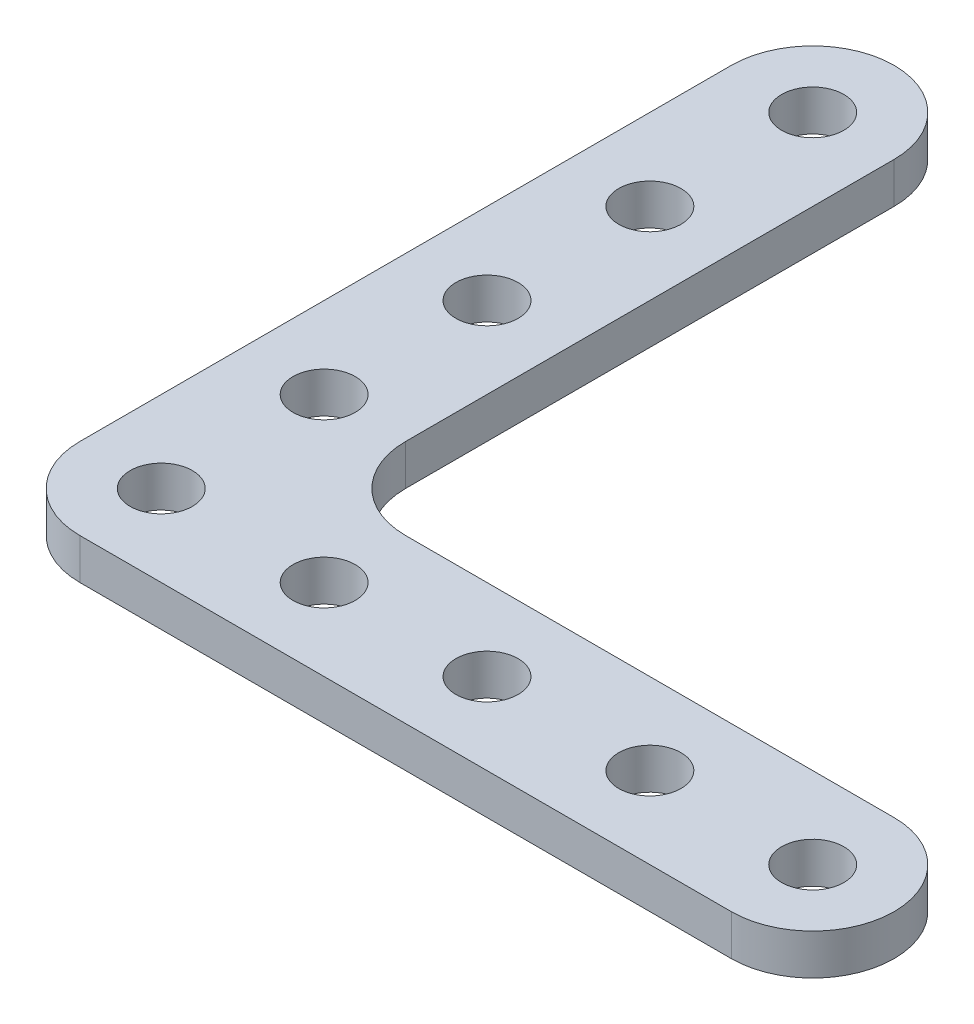
ISO-10303-21;
HEADER;
FILE_DESCRIPTION(('STEP AP214'),'2;1');
FILE_NAME('part.step','',(''),(''),'','','');
FILE_SCHEMA(('AUTOMOTIVE_DESIGN { 1 0 10303 214 1 1 1 1 }'));
ENDSEC;
DATA;
#1=APPLICATION_CONTEXT('core data for automotive mechanical design processes');
#2=APPLICATION_PROTOCOL_DEFINITION('international standard','automotive_design',2000,#1);
#3=PRODUCT_CONTEXT('',#1,'mechanical');
#4=PRODUCT('Part','Part','',(#3));
#5=PRODUCT_RELATED_PRODUCT_CATEGORY('part','',(#4));
#6=PRODUCT_DEFINITION_FORMATION('','',#4);
#7=PRODUCT_DEFINITION_CONTEXT('part definition',#1,'design');
#8=PRODUCT_DEFINITION('design','',#6,#7);
#9=PRODUCT_DEFINITION_SHAPE('','',#8);
#10=(LENGTH_UNIT() NAMED_UNIT(*) SI_UNIT(.MILLI.,.METRE.));
#11=(NAMED_UNIT(*) PLANE_ANGLE_UNIT() SI_UNIT($,.RADIAN.));
#12=(NAMED_UNIT(*) SI_UNIT($,.STERADIAN.) SOLID_ANGLE_UNIT());
#13=UNCERTAINTY_MEASURE_WITH_UNIT(LENGTH_MEASURE(1.E-05),#10,'distance_accuracy_value','');
#14=(GEOMETRIC_REPRESENTATION_CONTEXT(3) GLOBAL_UNCERTAINTY_ASSIGNED_CONTEXT((#13)) GLOBAL_UNIT_ASSIGNED_CONTEXT((#10,
#11,#12)) REPRESENTATION_CONTEXT('',''));
#15=CARTESIAN_POINT('',(0.,0.,0.));
#16=DIRECTION('',(0.,0.,1.));
#17=DIRECTION('',(1.,0.,0.));
#18=AXIS2_PLACEMENT_3D('',#15,#16,#17);
#19=CARTESIAN_POINT('',(-165.1,-28.575,349.25));
#20=DIRECTION('',(0.,0.,1.));
#21=DIRECTION('',(1.,0.,0.));
#22=AXIS2_PLACEMENT_3D('',#19,#20,#21);
#23=PLANE('',#22);
#24=DIRECTION('',(1.,0.,0.));
#25=VECTOR('',#24,1.);
#26=CARTESIAN_POINT('',(-165.1,-25.4,349.25));
#27=LINE('',#26,#25);
#28=CARTESIAN_POINT('',(-190.5,-25.4,349.25));
#29=VERTEX_POINT('',#28);
#30=CARTESIAN_POINT('',(-139.7,-25.4,349.25));
#31=VERTEX_POINT('',#30);
#32=EDGE_CURVE('E131',#29,#31,#27,.T.);
#33=ORIENTED_EDGE('',*,*,#32,.F.);
#34=DIRECTION('',(0.,1.,0.));
#35=VECTOR('',#34,1.);
#36=CARTESIAN_POINT('',(-190.5,-28.575,349.25));
#37=LINE('',#36,#35);
#38=CARTESIAN_POINT('',(-190.5,-28.575,349.25));
#39=VERTEX_POINT('',#38);
#40=EDGE_CURVE('E11',#39,#29,#37,.T.);
#41=ORIENTED_EDGE('',*,*,#40,.F.);
#42=DIRECTION('',(1.,0.,0.));
#43=VECTOR('',#42,1.);
#44=CARTESIAN_POINT('',(-165.1,-28.575,349.25));
#45=LINE('',#44,#43);
#46=CARTESIAN_POINT('',(-139.7,-28.575,349.25));
#47=VERTEX_POINT('',#46);
#48=EDGE_CURVE('E179',#39,#47,#45,.T.);
#49=ORIENTED_EDGE('',*,*,#48,.T.);
#50=DIRECTION('',(0.,1.,0.));
#51=VECTOR('',#50,1.);
#52=CARTESIAN_POINT('',(-139.7,-28.575,349.25));
#53=LINE('',#52,#51);
#54=EDGE_CURVE('E130',#47,#31,#53,.T.);
#55=ORIENTED_EDGE('',*,*,#54,.T.);
#56=EDGE_LOOP('',(#33,#41,#49,#55));
#57=FACE_BOUND('',#56,.T.);
#58=ADVANCED_FACE('F17',(#57),#23,.T.);
#59=CARTESIAN_POINT('',(-190.5,-28.575,342.9));
#60=DIRECTION('',(0.,1.,0.));
#61=DIRECTION('',(0.,0.,1.));
#62=AXIS2_PLACEMENT_3D('',#59,#60,#61);
#63=CYLINDRICAL_SURFACE('',#62,6.35);
#64=CARTESIAN_POINT('',(-190.5,-25.4,342.9));
#65=DIRECTION('',(0.,-1.,0.));
#66=DIRECTION('',(0.,0.,-1.));
#67=AXIS2_PLACEMENT_3D('',#64,#65,#66);
#68=CIRCLE('',#67,6.35);
#69=CARTESIAN_POINT('',(-196.85,-25.4,342.9));
#70=VERTEX_POINT('',#69);
#71=EDGE_CURVE('E152',#29,#70,#68,.T.);
#72=ORIENTED_EDGE('',*,*,#71,.T.);
#73=DIRECTION('',(0.,1.,0.));
#74=VECTOR('',#73,1.);
#75=CARTESIAN_POINT('',(-196.85,-28.575,342.9));
#76=LINE('',#75,#74);
#77=CARTESIAN_POINT('',(-196.85,-28.575,342.9));
#78=VERTEX_POINT('',#77);
#79=EDGE_CURVE('E26',#78,#70,#76,.T.);
#80=ORIENTED_EDGE('',*,*,#79,.F.);
#81=CARTESIAN_POINT('',(-190.5,-28.575,342.9));
#82=DIRECTION('',(0.,-1.,0.));
#83=DIRECTION('',(0.,0.,-1.));
#84=AXIS2_PLACEMENT_3D('',#81,#82,#83);
#85=CIRCLE('',#84,6.35);
#86=EDGE_CURVE('E105',#39,#78,#85,.T.);
#87=ORIENTED_EDGE('',*,*,#86,.F.);
#88=ORIENTED_EDGE('',*,*,#40,.T.);
#89=EDGE_LOOP('',(#72,#80,#87,#88));
#90=FACE_BOUND('',#89,.T.);
#91=ADVANCED_FACE('F210',(#90),#63,.T.);
#92=CARTESIAN_POINT('',(-196.85,-28.575,317.5));
#93=DIRECTION('',(-1.,0.,0.));
#94=DIRECTION('',(0.,0.,1.));
#95=AXIS2_PLACEMENT_3D('',#92,#93,#94);
#96=PLANE('',#95);
#97=DIRECTION('',(0.,0.,1.));
#98=VECTOR('',#97,1.);
#99=CARTESIAN_POINT('',(-196.85,-25.4,317.5));
#100=LINE('',#99,#98);
#101=CARTESIAN_POINT('',(-196.85,-25.4,292.1));
#102=VERTEX_POINT('',#101);
#103=EDGE_CURVE('E92',#102,#70,#100,.T.);
#104=ORIENTED_EDGE('',*,*,#103,.F.);
#105=DIRECTION('',(0.,1.,0.));
#106=VECTOR('',#105,1.);
#107=CARTESIAN_POINT('',(-196.85,-28.575,292.1));
#108=LINE('',#107,#106);
#109=CARTESIAN_POINT('',(-196.85,-28.575,292.1));
#110=VERTEX_POINT('',#109);
#111=EDGE_CURVE('E86',#110,#102,#108,.T.);
#112=ORIENTED_EDGE('',*,*,#111,.F.);
#113=DIRECTION('',(0.,0.,1.));
#114=VECTOR('',#113,1.);
#115=CARTESIAN_POINT('',(-196.85,-28.575,317.5));
#116=LINE('',#115,#114);
#117=EDGE_CURVE('E90',#110,#78,#116,.T.);
#118=ORIENTED_EDGE('',*,*,#117,.T.);
#119=ORIENTED_EDGE('',*,*,#79,.T.);
#120=EDGE_LOOP('',(#104,#112,#118,#119));
#121=FACE_BOUND('',#120,.T.);
#122=ADVANCED_FACE('F88',(#121),#96,.T.);
#123=CARTESIAN_POINT('',(-190.5,-28.575,292.1));
#124=DIRECTION('',(0.,1.,0.));
#125=DIRECTION('',(0.,0.,1.));
#126=AXIS2_PLACEMENT_3D('',#123,#124,#125);
#127=CYLINDRICAL_SURFACE('',#126,6.35);
#128=CARTESIAN_POINT('',(-190.5,-25.4,292.1));
#129=DIRECTION('',(0.,-1.,0.));
#130=DIRECTION('',(0.,0.,-1.));
#131=AXIS2_PLACEMENT_3D('',#128,#129,#130);
#132=CIRCLE('',#131,6.35);
#133=CARTESIAN_POINT('',(-184.15,-25.4,292.1));
#134=VERTEX_POINT('',#133);
#135=EDGE_CURVE('E156',#102,#134,#132,.T.);
#136=ORIENTED_EDGE('',*,*,#135,.T.);
#137=DIRECTION('',(0.,1.,0.));
#138=VECTOR('',#137,1.);
#139=CARTESIAN_POINT('',(-184.15,-28.575,292.1));
#140=LINE('',#139,#138);
#141=CARTESIAN_POINT('',(-184.15,-28.575,292.1));
#142=VERTEX_POINT('',#141);
#143=EDGE_CURVE('E61',#142,#134,#140,.T.);
#144=ORIENTED_EDGE('',*,*,#143,.F.);
#145=CARTESIAN_POINT('',(-190.5,-28.575,292.1));
#146=DIRECTION('',(0.,-1.,0.));
#147=DIRECTION('',(0.,0.,-1.));
#148=AXIS2_PLACEMENT_3D('',#145,#146,#147);
#149=CIRCLE('',#148,6.35);
#150=EDGE_CURVE('E96',#110,#142,#149,.T.);
#151=ORIENTED_EDGE('',*,*,#150,.F.);
#152=ORIENTED_EDGE('',*,*,#111,.T.);
#153=EDGE_LOOP('',(#136,#144,#151,#152));
#154=FACE_BOUND('',#153,.T.);
#155=ADVANCED_FACE('F97',(#154),#127,.T.);
#156=CARTESIAN_POINT('',(-184.15,-28.575,311.15));
#157=DIRECTION('',(1.,0.,0.));
#158=DIRECTION('',(0.,0.,-1.));
#159=AXIS2_PLACEMENT_3D('',#156,#157,#158);
#160=PLANE('',#159);
#161=DIRECTION('',(0.,0.,-1.));
#162=VECTOR('',#161,1.);
#163=CARTESIAN_POINT('',(-184.15,-25.4,311.15));
#164=LINE('',#163,#162);
#165=CARTESIAN_POINT('',(-184.15,-25.4,330.2));
#166=VERTEX_POINT('',#165);
#167=EDGE_CURVE('E158',#166,#134,#164,.T.);
#168=ORIENTED_EDGE('',*,*,#167,.F.);
#169=DIRECTION('',(0.,1.,0.));
#170=VECTOR('',#169,1.);
#171=CARTESIAN_POINT('',(-184.15,-28.575,330.2));
#172=LINE('',#171,#170);
#173=CARTESIAN_POINT('',(-184.15,-28.575,330.2));
#174=VERTEX_POINT('',#173);
#175=EDGE_CURVE('E35',#174,#166,#172,.T.);
#176=ORIENTED_EDGE('',*,*,#175,.F.);
#177=DIRECTION('',(0.,0.,-1.));
#178=VECTOR('',#177,1.);
#179=CARTESIAN_POINT('',(-184.15,-28.575,311.15));
#180=LINE('',#179,#178);
#181=EDGE_CURVE('E99',#174,#142,#180,.T.);
#182=ORIENTED_EDGE('',*,*,#181,.T.);
#183=ORIENTED_EDGE('',*,*,#143,.T.);
#184=EDGE_LOOP('',(#168,#176,#182,#183));
#185=FACE_BOUND('',#184,.T.);
#186=ADVANCED_FACE('F198',(#185),#160,.T.);
#187=CARTESIAN_POINT('',(-177.8,-28.575,330.2));
#188=DIRECTION('',(0.,1.,0.));
#189=DIRECTION('',(0.,0.,1.));
#190=AXIS2_PLACEMENT_3D('',#187,#188,#189);
#191=CYLINDRICAL_SURFACE('',#190,6.35);
#192=CARTESIAN_POINT('',(-177.8,-25.4,330.2));
#193=DIRECTION('',(0.,-1.,0.));
#194=DIRECTION('',(0.,0.,-1.));
#195=AXIS2_PLACEMENT_3D('',#192,#193,#194);
#196=CIRCLE('',#195,6.35);
#197=CARTESIAN_POINT('',(-177.8,-25.4,336.55));
#198=VERTEX_POINT('',#197);
#199=EDGE_CURVE('E161',#198,#166,#196,.T.);
#200=ORIENTED_EDGE('',*,*,#199,.F.);
#201=DIRECTION('',(0.,1.,0.));
#202=VECTOR('',#201,1.);
#203=CARTESIAN_POINT('',(-177.8,-28.575,336.55));
#204=LINE('',#203,#202);
#205=CARTESIAN_POINT('',(-177.8,-28.575,336.55));
#206=VERTEX_POINT('',#205);
#207=EDGE_CURVE('E20',#206,#198,#204,.T.);
#208=ORIENTED_EDGE('',*,*,#207,.F.);
#209=CARTESIAN_POINT('',(-177.8,-28.575,330.2));
#210=DIRECTION('',(0.,-1.,0.));
#211=DIRECTION('',(0.,0.,-1.));
#212=AXIS2_PLACEMENT_3D('',#209,#210,#211);
#213=CIRCLE('',#212,6.35);
#214=EDGE_CURVE('E113',#206,#174,#213,.T.);
#215=ORIENTED_EDGE('',*,*,#214,.T.);
#216=ORIENTED_EDGE('',*,*,#175,.T.);
#217=EDGE_LOOP('',(#200,#208,#215,#216));
#218=FACE_BOUND('',#217,.T.);
#219=ADVANCED_FACE('F196',(#218),#191,.F.);
#220=CARTESIAN_POINT('',(-158.75,-28.575,336.55));
#221=DIRECTION('',(0.,0.,-1.));
#222=DIRECTION('',(-1.,0.,0.));
#223=AXIS2_PLACEMENT_3D('',#220,#221,#222);
#224=PLANE('',#223);
#225=DIRECTION('',(-1.,0.,0.));
#226=VECTOR('',#225,1.);
#227=CARTESIAN_POINT('',(-158.75,-25.4,336.55));
#228=LINE('',#227,#226);
#229=CARTESIAN_POINT('',(-139.7,-25.4,336.55));
#230=VERTEX_POINT('',#229);
#231=EDGE_CURVE('E137',#230,#198,#228,.T.);
#232=ORIENTED_EDGE('',*,*,#231,.F.);
#233=DIRECTION('',(0.,1.,0.));
#234=VECTOR('',#233,1.);
#235=CARTESIAN_POINT('',(-139.7,-28.575,336.55));
#236=LINE('',#235,#234);
#237=CARTESIAN_POINT('',(-139.7,-28.575,336.55));
#238=VERTEX_POINT('',#237);
#239=EDGE_CURVE('E183',#238,#230,#236,.T.);
#240=ORIENTED_EDGE('',*,*,#239,.F.);
#241=DIRECTION('',(-1.,0.,0.));
#242=VECTOR('',#241,1.);
#243=CARTESIAN_POINT('',(-158.75,-28.575,336.55));
#244=LINE('',#243,#242);
#245=EDGE_CURVE('E191',#238,#206,#244,.T.);
#246=ORIENTED_EDGE('',*,*,#245,.T.);
#247=ORIENTED_EDGE('',*,*,#207,.T.);
#248=EDGE_LOOP('',(#232,#240,#246,#247));
#249=FACE_BOUND('',#248,.T.);
#250=ADVANCED_FACE('F189',(#249),#224,.T.);
#251=CARTESIAN_POINT('',(-190.5,-28.575,304.8));
#252=DIRECTION('',(0.,1.,0.));
#253=DIRECTION('',(0.,0.,1.));
#254=AXIS2_PLACEMENT_3D('',#251,#252,#253);
#255=CYLINDRICAL_SURFACE('',#254,2.4257);
#256=CARTESIAN_POINT('',(-190.5,-28.575,304.8));
#257=DIRECTION('',(0.,-1.,0.));
#258=DIRECTION('',(0.,0.,-1.));
#259=AXIS2_PLACEMENT_3D('',#256,#257,#258);
#260=CIRCLE('',#259,2.4257);
#261=CARTESIAN_POINT('',(-190.5,-28.575,302.3743));
#262=VERTEX_POINT('',#261);
#263=EDGE_CURVE('E124',#262,#262,#260,.T.);
#264=ORIENTED_EDGE('',*,*,#263,.T.);
#265=EDGE_LOOP('',(#264));
#266=FACE_BOUND('',#265,.T.);
#267=CARTESIAN_POINT('',(-190.5,-25.4,304.8));
#268=DIRECTION('',(0.,-1.,0.));
#269=DIRECTION('',(0.,0.,-1.));
#270=AXIS2_PLACEMENT_3D('',#267,#268,#269);
#271=CIRCLE('',#270,2.4257);
#272=CARTESIAN_POINT('',(-190.5,-25.4,302.3743));
#273=VERTEX_POINT('',#272);
#274=EDGE_CURVE('E173',#273,#273,#271,.T.);
#275=ORIENTED_EDGE('',*,*,#274,.F.);
#276=EDGE_LOOP('',(#275));
#277=FACE_BOUND('',#276,.T.);
#278=ADVANCED_FACE('F205',(#266,#277),#255,.F.);
#279=CARTESIAN_POINT('',(-190.5,-28.575,317.5));
#280=DIRECTION('',(0.,1.,0.));
#281=DIRECTION('',(0.,0.,1.));
#282=AXIS2_PLACEMENT_3D('',#279,#280,#281);
#283=CYLINDRICAL_SURFACE('',#282,2.4257);
#284=CARTESIAN_POINT('',(-190.5,-28.575,317.5));
#285=DIRECTION('',(0.,-1.,0.));
#286=DIRECTION('',(0.,0.,-1.));
#287=AXIS2_PLACEMENT_3D('',#284,#285,#286);
#288=CIRCLE('',#287,2.4257);
#289=CARTESIAN_POINT('',(-190.5,-28.575,315.0743));
#290=VERTEX_POINT('',#289);
#291=EDGE_CURVE('E121',#290,#290,#288,.T.);
#292=ORIENTED_EDGE('',*,*,#291,.T.);
#293=EDGE_LOOP('',(#292));
#294=FACE_BOUND('',#293,.T.);
#295=CARTESIAN_POINT('',(-190.5,-25.4,317.5));
#296=DIRECTION('',(0.,-1.,0.));
#297=DIRECTION('',(0.,0.,-1.));
#298=AXIS2_PLACEMENT_3D('',#295,#296,#297);
#299=CIRCLE('',#298,2.4257);
#300=CARTESIAN_POINT('',(-190.5,-25.4,315.0743));
#301=VERTEX_POINT('',#300);
#302=EDGE_CURVE('E170',#301,#301,#299,.T.);
#303=ORIENTED_EDGE('',*,*,#302,.F.);
#304=EDGE_LOOP('',(#303));
#305=FACE_BOUND('',#304,.T.);
#306=ADVANCED_FACE('F267',(#294,#305),#283,.F.);
#307=CARTESIAN_POINT('',(-190.5,-28.575,330.2));
#308=DIRECTION('',(0.,1.,0.));
#309=DIRECTION('',(0.,0.,1.));
#310=AXIS2_PLACEMENT_3D('',#307,#308,#309);
#311=CYLINDRICAL_SURFACE('',#310,2.4257);
#312=CARTESIAN_POINT('',(-190.5,-28.575,330.2));
#313=DIRECTION('',(0.,-1.,0.));
#314=DIRECTION('',(0.,0.,-1.));
#315=AXIS2_PLACEMENT_3D('',#312,#313,#314);
#316=CIRCLE('',#315,2.4257);
#317=CARTESIAN_POINT('',(-190.5,-28.575,327.7743));
#318=VERTEX_POINT('',#317);
#319=EDGE_CURVE('E118',#318,#318,#316,.T.);
#320=ORIENTED_EDGE('',*,*,#319,.T.);
#321=EDGE_LOOP('',(#320));
#322=FACE_BOUND('',#321,.T.);
#323=CARTESIAN_POINT('',(-190.5,-25.4,330.2));
#324=DIRECTION('',(0.,-1.,0.));
#325=DIRECTION('',(0.,0.,-1.));
#326=AXIS2_PLACEMENT_3D('',#323,#324,#325);
#327=CIRCLE('',#326,2.4257);
#328=CARTESIAN_POINT('',(-190.5,-25.4,327.7743));
#329=VERTEX_POINT('',#328);
#330=EDGE_CURVE('E167',#329,#329,#327,.T.);
#331=ORIENTED_EDGE('',*,*,#330,.F.);
#332=EDGE_LOOP('',(#331));
#333=FACE_BOUND('',#332,.T.);
#334=ADVANCED_FACE('F271',(#322,#333),#311,.F.);
#335=CARTESIAN_POINT('',(-190.5,-28.575,342.9));
#336=DIRECTION('',(0.,1.,0.));
#337=DIRECTION('',(0.,0.,1.));
#338=AXIS2_PLACEMENT_3D('',#335,#336,#337);
#339=CYLINDRICAL_SURFACE('',#338,2.4257);
#340=CARTESIAN_POINT('',(-190.5,-28.575,342.9));
#341=DIRECTION('',(0.,-1.,0.));
#342=DIRECTION('',(0.,0.,-1.));
#343=AXIS2_PLACEMENT_3D('',#340,#341,#342);
#344=CIRCLE('',#343,2.4257);
#345=CARTESIAN_POINT('',(-190.5,-28.575,340.4743));
#346=VERTEX_POINT('',#345);
#347=EDGE_CURVE('E115',#346,#346,#344,.T.);
#348=ORIENTED_EDGE('',*,*,#347,.T.);
#349=EDGE_LOOP('',(#348));
#350=FACE_BOUND('',#349,.T.);
#351=CARTESIAN_POINT('',(-190.5,-25.4,342.9));
#352=DIRECTION('',(0.,-1.,0.));
#353=DIRECTION('',(0.,0.,-1.));
#354=AXIS2_PLACEMENT_3D('',#351,#352,#353);
#355=CIRCLE('',#354,2.4257);
#356=CARTESIAN_POINT('',(-190.5,-25.4,340.4743));
#357=VERTEX_POINT('',#356);
#358=EDGE_CURVE('E164',#357,#357,#355,.T.);
#359=ORIENTED_EDGE('',*,*,#358,.F.);
#360=EDGE_LOOP('',(#359));
#361=FACE_BOUND('',#360,.T.);
#362=ADVANCED_FACE('F274',(#350,#361),#339,.F.);
#363=CARTESIAN_POINT('',(-139.7,-28.575,342.9));
#364=DIRECTION('',(0.,1.,0.));
#365=DIRECTION('',(0.,0.,1.));
#366=AXIS2_PLACEMENT_3D('',#363,#364,#365);
#367=CYLINDRICAL_SURFACE('',#366,2.4257);
#368=CARTESIAN_POINT('',(-139.7,-28.575,342.9));
#369=DIRECTION('',(0.,-1.,0.));
#370=DIRECTION('',(0.,0.,-1.));
#371=AXIS2_PLACEMENT_3D('',#368,#369,#370);
#372=CIRCLE('',#371,2.4257);
#373=CARTESIAN_POINT('',(-139.7,-28.575,340.4743));
#374=VERTEX_POINT('',#373);
#375=EDGE_CURVE('E108',#374,#374,#372,.T.);
#376=ORIENTED_EDGE('',*,*,#375,.T.);
#377=EDGE_LOOP('',(#376));
#378=FACE_BOUND('',#377,.T.);
#379=CARTESIAN_POINT('',(-139.7,-25.4,342.9));
#380=DIRECTION('',(0.,-1.,0.));
#381=DIRECTION('',(0.,0.,-1.));
#382=AXIS2_PLACEMENT_3D('',#379,#380,#381);
#383=CIRCLE('',#382,2.4257);
#384=CARTESIAN_POINT('',(-139.7,-25.4,340.4743));
#385=VERTEX_POINT('',#384);
#386=EDGE_CURVE('E149',#385,#385,#383,.T.);
#387=ORIENTED_EDGE('',*,*,#386,.F.);
#388=EDGE_LOOP('',(#387));
#389=FACE_BOUND('',#388,.T.);
#390=ADVANCED_FACE('F237',(#378,#389),#367,.F.);
#391=CARTESIAN_POINT('',(-152.4,-28.575,342.9));
#392=DIRECTION('',(0.,1.,0.));
#393=DIRECTION('',(0.,0.,1.));
#394=AXIS2_PLACEMENT_3D('',#391,#392,#393);
#395=CYLINDRICAL_SURFACE('',#394,2.4257);
#396=CARTESIAN_POINT('',(-152.4,-28.575,342.9));
#397=DIRECTION('',(0.,-1.,0.));
#398=DIRECTION('',(0.,0.,-1.));
#399=AXIS2_PLACEMENT_3D('',#396,#397,#398);
#400=CIRCLE('',#399,2.4257);
#401=CARTESIAN_POINT('',(-152.4,-28.575,340.4743));
#402=VERTEX_POINT('',#401);
#403=EDGE_CURVE('E232',#402,#402,#400,.T.);
#404=ORIENTED_EDGE('',*,*,#403,.T.);
#405=EDGE_LOOP('',(#404));
#406=FACE_BOUND('',#405,.T.);
#407=CARTESIAN_POINT('',(-152.4,-25.4,342.9));
#408=DIRECTION('',(0.,-1.,0.));
#409=DIRECTION('',(0.,0.,-1.));
#410=AXIS2_PLACEMENT_3D('',#407,#408,#409);
#411=CIRCLE('',#410,2.4257);
#412=CARTESIAN_POINT('',(-152.4,-25.4,340.4743));
#413=VERTEX_POINT('',#412);
#414=EDGE_CURVE('E146',#413,#413,#411,.T.);
#415=ORIENTED_EDGE('',*,*,#414,.F.);
#416=EDGE_LOOP('',(#415));
#417=FACE_BOUND('',#416,.T.);
#418=ADVANCED_FACE('F281',(#406,#417),#395,.F.);
#419=CARTESIAN_POINT('',(-165.1,-28.575,342.9));
#420=DIRECTION('',(0.,1.,0.));
#421=DIRECTION('',(0.,0.,1.));
#422=AXIS2_PLACEMENT_3D('',#419,#420,#421);
#423=CYLINDRICAL_SURFACE('',#422,2.4257);
#424=CARTESIAN_POINT('',(-165.1,-28.575,342.9));
#425=DIRECTION('',(0.,-1.,0.));
#426=DIRECTION('',(0.,0.,-1.));
#427=AXIS2_PLACEMENT_3D('',#424,#425,#426);
#428=CIRCLE('',#427,2.4257);
#429=CARTESIAN_POINT('',(-165.1,-28.575,340.4743));
#430=VERTEX_POINT('',#429);
#431=EDGE_CURVE('E229',#430,#430,#428,.T.);
#432=ORIENTED_EDGE('',*,*,#431,.T.);
#433=EDGE_LOOP('',(#432));
#434=FACE_BOUND('',#433,.T.);
#435=CARTESIAN_POINT('',(-165.1,-25.4,342.9));
#436=DIRECTION('',(0.,-1.,0.));
#437=DIRECTION('',(0.,0.,-1.));
#438=AXIS2_PLACEMENT_3D('',#435,#436,#437);
#439=CIRCLE('',#438,2.4257);
#440=CARTESIAN_POINT('',(-165.1,-25.4,340.4743));
#441=VERTEX_POINT('',#440);
#442=EDGE_CURVE('E143',#441,#441,#439,.T.);
#443=ORIENTED_EDGE('',*,*,#442,.F.);
#444=EDGE_LOOP('',(#443));
#445=FACE_BOUND('',#444,.T.);
#446=ADVANCED_FACE('F298',(#434,#445),#423,.F.);
#447=CARTESIAN_POINT('',(-177.8,-28.575,342.9));
#448=DIRECTION('',(0.,1.,0.));
#449=DIRECTION('',(0.,0.,1.));
#450=AXIS2_PLACEMENT_3D('',#447,#448,#449);
#451=CYLINDRICAL_SURFACE('',#450,2.4257);
#452=CARTESIAN_POINT('',(-177.8,-28.575,342.9));
#453=DIRECTION('',(0.,-1.,0.));
#454=DIRECTION('',(0.,0.,-1.));
#455=AXIS2_PLACEMENT_3D('',#452,#453,#454);
#456=CIRCLE('',#455,2.4257);
#457=CARTESIAN_POINT('',(-177.8,-28.575,340.4743));
#458=VERTEX_POINT('',#457);
#459=EDGE_CURVE('E222',#458,#458,#456,.T.);
#460=ORIENTED_EDGE('',*,*,#459,.T.);
#461=EDGE_LOOP('',(#460));
#462=FACE_BOUND('',#461,.T.);
#463=CARTESIAN_POINT('',(-177.8,-25.4,342.9));
#464=DIRECTION('',(0.,-1.,0.));
#465=DIRECTION('',(0.,0.,-1.));
#466=AXIS2_PLACEMENT_3D('',#463,#464,#465);
#467=CIRCLE('',#466,2.4257);
#468=CARTESIAN_POINT('',(-177.8,-25.4,340.4743));
#469=VERTEX_POINT('',#468);
#470=EDGE_CURVE('E134',#469,#469,#467,.T.);
#471=ORIENTED_EDGE('',*,*,#470,.F.);
#472=EDGE_LOOP('',(#471));
#473=FACE_BOUND('',#472,.T.);
#474=ADVANCED_FACE('F305',(#462,#473),#451,.F.);
#475=CARTESIAN_POINT('',(-139.7,-28.575,342.9));
#476=DIRECTION('',(0.,1.,0.));
#477=DIRECTION('',(0.,0.,1.));
#478=AXIS2_PLACEMENT_3D('',#475,#476,#477);
#479=CYLINDRICAL_SURFACE('',#478,6.35);
#480=CARTESIAN_POINT('',(-139.7,-25.4,342.9));
#481=DIRECTION('',(0.,-1.,0.));
#482=DIRECTION('',(0.,0.,-1.));
#483=AXIS2_PLACEMENT_3D('',#480,#481,#482);
#484=CIRCLE('',#483,6.35);
#485=EDGE_CURVE('E140',#230,#31,#484,.T.);
#486=ORIENTED_EDGE('',*,*,#485,.T.);
#487=ORIENTED_EDGE('',*,*,#54,.F.);
#488=CARTESIAN_POINT('',(-139.7,-28.575,342.9));
#489=DIRECTION('',(0.,-1.,0.));
#490=DIRECTION('',(0.,0.,-1.));
#491=AXIS2_PLACEMENT_3D('',#488,#489,#490);
#492=CIRCLE('',#491,6.35);
#493=EDGE_CURVE('E221',#238,#47,#492,.T.);
#494=ORIENTED_EDGE('',*,*,#493,.F.);
#495=ORIENTED_EDGE('',*,*,#239,.T.);
#496=EDGE_LOOP('',(#486,#487,#494,#495));
#497=FACE_BOUND('',#496,.T.);
#498=ADVANCED_FACE('F256',(#497),#479,.T.);
#499=CARTESIAN_POINT('',(-190.5,-28.575,292.1));
#500=DIRECTION('',(0.,1.,0.));
#501=DIRECTION('',(0.,0.,1.));
#502=AXIS2_PLACEMENT_3D('',#499,#500,#501);
#503=CYLINDRICAL_SURFACE('',#502,2.4257);
#504=CARTESIAN_POINT('',(-190.5,-28.575,292.1));
#505=DIRECTION('',(0.,-1.,0.));
#506=DIRECTION('',(0.,0.,-1.));
#507=AXIS2_PLACEMENT_3D('',#504,#505,#506);
#508=CIRCLE('',#507,2.4257);
#509=CARTESIAN_POINT('',(-190.5,-28.575,289.6743));
#510=VERTEX_POINT('',#509);
#511=EDGE_CURVE('E127',#510,#510,#508,.T.);
#512=ORIENTED_EDGE('',*,*,#511,.T.);
#513=EDGE_LOOP('',(#512));
#514=FACE_BOUND('',#513,.T.);
#515=CARTESIAN_POINT('',(-190.5,-25.4,292.1));
#516=DIRECTION('',(0.,-1.,0.));
#517=DIRECTION('',(0.,0.,-1.));
#518=AXIS2_PLACEMENT_3D('',#515,#516,#517);
#519=CIRCLE('',#518,2.4257);
#520=CARTESIAN_POINT('',(-190.5,-25.4,289.6743));
#521=VERTEX_POINT('',#520);
#522=EDGE_CURVE('E176',#521,#521,#519,.T.);
#523=ORIENTED_EDGE('',*,*,#522,.F.);
#524=EDGE_LOOP('',(#523));
#525=FACE_BOUND('',#524,.T.);
#526=ADVANCED_FACE('F242',(#514,#525),#503,.F.);
#527=CARTESIAN_POINT('',(-168.275,-28.575,228.6));
#528=DIRECTION('',(0.,-1.,0.));
#529=DIRECTION('',(1.,0.,0.));
#530=AXIS2_PLACEMENT_3D('',#527,#528,#529);
#531=PLANE('',#530);
#532=ORIENTED_EDGE('',*,*,#48,.F.);
#533=ORIENTED_EDGE('',*,*,#86,.T.);
#534=ORIENTED_EDGE('',*,*,#117,.F.);
#535=ORIENTED_EDGE('',*,*,#150,.T.);
#536=ORIENTED_EDGE('',*,*,#181,.F.);
#537=ORIENTED_EDGE('',*,*,#214,.F.);
#538=ORIENTED_EDGE('',*,*,#245,.F.);
#539=ORIENTED_EDGE('',*,*,#493,.T.);
#540=EDGE_LOOP('',(#532,#533,#534,#535,#536,#537,#538,#539));
#541=FACE_BOUND('',#540,.T.);
#542=ORIENTED_EDGE('',*,*,#459,.F.);
#543=EDGE_LOOP('',(#542));
#544=FACE_BOUND('',#543,.T.);
#545=ORIENTED_EDGE('',*,*,#431,.F.);
#546=EDGE_LOOP('',(#545));
#547=FACE_BOUND('',#546,.T.);
#548=ORIENTED_EDGE('',*,*,#403,.F.);
#549=EDGE_LOOP('',(#548));
#550=FACE_BOUND('',#549,.T.);
#551=ORIENTED_EDGE('',*,*,#375,.F.);
#552=EDGE_LOOP('',(#551));
#553=FACE_BOUND('',#552,.T.);
#554=ORIENTED_EDGE('',*,*,#347,.F.);
#555=EDGE_LOOP('',(#554));
#556=FACE_BOUND('',#555,.T.);
#557=ORIENTED_EDGE('',*,*,#319,.F.);
#558=EDGE_LOOP('',(#557));
#559=FACE_BOUND('',#558,.T.);
#560=ORIENTED_EDGE('',*,*,#291,.F.);
#561=EDGE_LOOP('',(#560));
#562=FACE_BOUND('',#561,.T.);
#563=ORIENTED_EDGE('',*,*,#263,.F.);
#564=EDGE_LOOP('',(#563));
#565=FACE_BOUND('',#564,.T.);
#566=ORIENTED_EDGE('',*,*,#511,.F.);
#567=EDGE_LOOP('',(#566));
#568=FACE_BOUND('',#567,.T.);
#569=ADVANCED_FACE('F102',(#541,#544,#547,#550,#553,#556,#559,#562,#565,#568),#531,.T.);
#570=CARTESIAN_POINT('',(-168.275,-25.4,228.6));
#571=DIRECTION('',(0.,-1.,0.));
#572=DIRECTION('',(1.,0.,0.));
#573=AXIS2_PLACEMENT_3D('',#570,#571,#572);
#574=PLANE('',#573);
#575=ORIENTED_EDGE('',*,*,#32,.T.);
#576=ORIENTED_EDGE('',*,*,#485,.F.);
#577=ORIENTED_EDGE('',*,*,#231,.T.);
#578=ORIENTED_EDGE('',*,*,#199,.T.);
#579=ORIENTED_EDGE('',*,*,#167,.T.);
#580=ORIENTED_EDGE('',*,*,#135,.F.);
#581=ORIENTED_EDGE('',*,*,#103,.T.);
#582=ORIENTED_EDGE('',*,*,#71,.F.);
#583=EDGE_LOOP('',(#575,#576,#577,#578,#579,#580,#581,#582));
#584=FACE_BOUND('',#583,.T.);
#585=ORIENTED_EDGE('',*,*,#470,.T.);
#586=EDGE_LOOP('',(#585));
#587=FACE_BOUND('',#586,.T.);
#588=ORIENTED_EDGE('',*,*,#442,.T.);
#589=EDGE_LOOP('',(#588));
#590=FACE_BOUND('',#589,.T.);
#591=ORIENTED_EDGE('',*,*,#414,.T.);
#592=EDGE_LOOP('',(#591));
#593=FACE_BOUND('',#592,.T.);
#594=ORIENTED_EDGE('',*,*,#386,.T.);
#595=EDGE_LOOP('',(#594));
#596=FACE_BOUND('',#595,.T.);
#597=ORIENTED_EDGE('',*,*,#358,.T.);
#598=EDGE_LOOP('',(#597));
#599=FACE_BOUND('',#598,.T.);
#600=ORIENTED_EDGE('',*,*,#330,.T.);
#601=EDGE_LOOP('',(#600));
#602=FACE_BOUND('',#601,.T.);
#603=ORIENTED_EDGE('',*,*,#302,.T.);
#604=EDGE_LOOP('',(#603));
#605=FACE_BOUND('',#604,.T.);
#606=ORIENTED_EDGE('',*,*,#274,.T.);
#607=EDGE_LOOP('',(#606));
#608=FACE_BOUND('',#607,.T.);
#609=ORIENTED_EDGE('',*,*,#522,.T.);
#610=EDGE_LOOP('',(#609));
#611=FACE_BOUND('',#610,.T.);
#612=ADVANCED_FACE('F194',(#584,#587,#590,#593,#596,#599,#602,#605,#608,#611),#574,.F.);
#613=CLOSED_SHELL('',(#58,#91,#122,#155,#186,#219,#250,#278,#306,#334,#362,#390,#418,#446,#474,
#498,#526,#569,#612));
#614=MANIFOLD_SOLID_BREP('B1',#613);
#615=ADVANCED_BREP_SHAPE_REPRESENTATION('',(#18,#614),#14);
#616=SHAPE_DEFINITION_REPRESENTATION(#9,#615);
ENDSEC;
END-ISO-10303-21;
